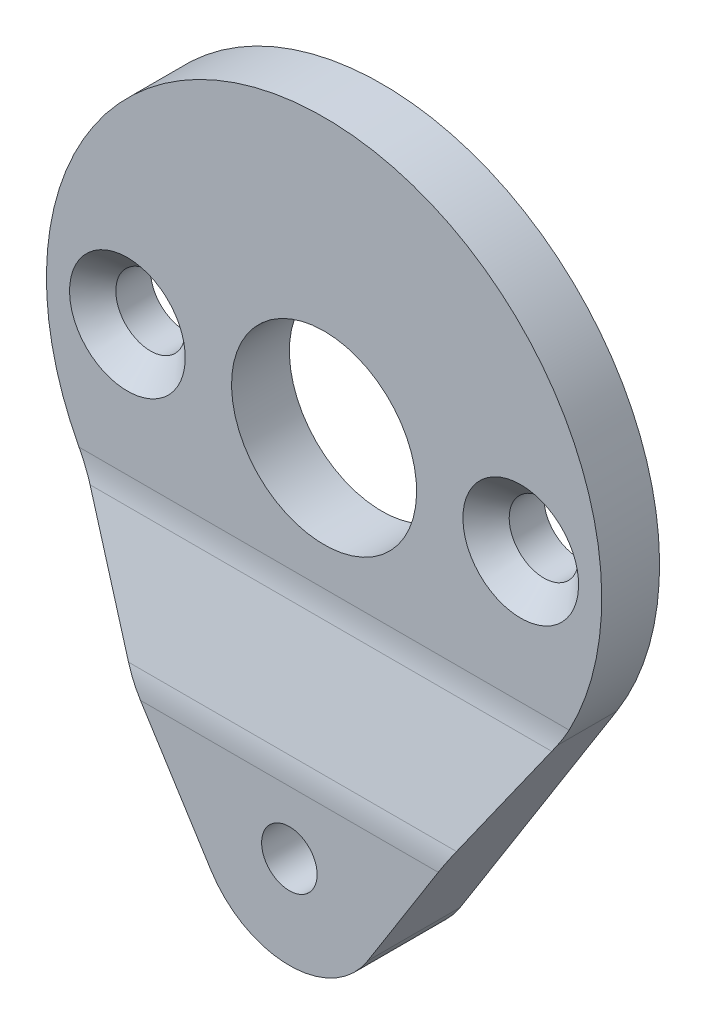
ISO-10303-21;
HEADER;
FILE_DESCRIPTION(('STEP AP214'),'2;1');
FILE_NAME('part.step','',(''),(''),'','','');
FILE_SCHEMA(('AUTOMOTIVE_DESIGN { 1 0 10303 214 1 1 1 1 }'));
ENDSEC;
DATA;
#1=APPLICATION_CONTEXT('core data for automotive mechanical design processes');
#2=APPLICATION_PROTOCOL_DEFINITION('international standard','automotive_design',2000,#1);
#3=PRODUCT_CONTEXT('',#1,'mechanical');
#4=PRODUCT('Part','Part','',(#3));
#5=PRODUCT_RELATED_PRODUCT_CATEGORY('part','',(#4));
#6=PRODUCT_DEFINITION_FORMATION('','',#4);
#7=PRODUCT_DEFINITION_CONTEXT('part definition',#1,'design');
#8=PRODUCT_DEFINITION('design','',#6,#7);
#9=PRODUCT_DEFINITION_SHAPE('','',#8);
#10=(LENGTH_UNIT() NAMED_UNIT(*) SI_UNIT(.MILLI.,.METRE.));
#11=(NAMED_UNIT(*) PLANE_ANGLE_UNIT() SI_UNIT($,.RADIAN.));
#12=(NAMED_UNIT(*) SI_UNIT($,.STERADIAN.) SOLID_ANGLE_UNIT());
#13=UNCERTAINTY_MEASURE_WITH_UNIT(LENGTH_MEASURE(1.E-05),#10,'distance_accuracy_value','');
#14=(GEOMETRIC_REPRESENTATION_CONTEXT(3) GLOBAL_UNCERTAINTY_ASSIGNED_CONTEXT((#13)) GLOBAL_UNIT_ASSIGNED_CONTEXT((#10,
#11,#12)) REPRESENTATION_CONTEXT('',''));
#15=CARTESIAN_POINT('',(0.,0.,0.));
#16=DIRECTION('',(0.,0.,1.));
#17=DIRECTION('',(1.,0.,0.));
#18=AXIS2_PLACEMENT_3D('',#15,#16,#17);
#19=CARTESIAN_POINT('',(0.,0.,4.));
#20=DIRECTION('',(0.,0.,1.));
#21=DIRECTION('',(1.,0.,0.));
#22=AXIS2_PLACEMENT_3D('',#19,#20,#21);
#23=PLANE('',#22);
#24=DIRECTION('',(0.533333333333333,0.845905169363301,0.));
#25=VECTOR('',#24,1.);
#26=CARTESIAN_POINT('',(10.1508620323596,-6.4,4.));
#27=LINE('',#26,#25);
#28=CARTESIAN_POINT('',(3.38362067745321,-17.1333333333333,4.));
#29=VERTEX_POINT('',#28);
#30=CARTESIAN_POINT('',(6.43521990416724,-12.2932766570162,4.));
#31=VERTEX_POINT('',#30);
#32=EDGE_CURVE('E125',#29,#31,#27,.T.);
#33=ORIENTED_EDGE('',*,*,#32,.T.);
#34=DIRECTION('',(1.,0.,0.));
#35=VECTOR('',#34,1.);
#36=CARTESIAN_POINT('',(-6.76724135490642,-12.2932766570162,4.));
#37=LINE('',#36,#35);
#38=CARTESIAN_POINT('',(-6.43521990416724,-12.2932766570162,4.));
#39=VERTEX_POINT('',#38);
#40=EDGE_CURVE('E108',#31,#39,#37,.F.);
#41=ORIENTED_EDGE('',*,*,#40,.T.);
#42=DIRECTION('',(0.533333333333333,-0.845905169363301,0.));
#43=VECTOR('',#42,1.);
#44=CARTESIAN_POINT('',(-10.1508620323596,-6.4,4.));
#45=LINE('',#44,#43);
#46=CARTESIAN_POINT('',(-3.38362067745321,-17.1333333333333,4.));
#47=VERTEX_POINT('',#46);
#48=EDGE_CURVE('E100',#39,#47,#45,.T.);
#49=ORIENTED_EDGE('',*,*,#48,.T.);
#50=CARTESIAN_POINT('',(0.,-15.,4.));
#51=DIRECTION('',(0.,0.,1.));
#52=DIRECTION('',(1.,0.,0.));
#53=AXIS2_PLACEMENT_3D('',#50,#51,#52);
#54=CIRCLE('',#53,4.);
#55=EDGE_CURVE('E105',#47,#29,#54,.T.);
#56=ORIENTED_EDGE('',*,*,#55,.T.);
#57=EDGE_LOOP('',(#33,#41,#49,#56));
#58=FACE_BOUND('',#57,.T.);
#59=CARTESIAN_POINT('',(0.,-15.,4.));
#60=DIRECTION('',(0.,0.,1.));
#61=DIRECTION('',(1.,0.,0.));
#62=AXIS2_PLACEMENT_3D('',#59,#60,#61);
#63=CIRCLE('',#62,1.2);
#64=CARTESIAN_POINT('',(1.2,-15.,4.));
#65=VERTEX_POINT('',#64);
#66=EDGE_CURVE('E328',#65,#65,#63,.T.);
#67=ORIENTED_EDGE('',*,*,#66,.F.);
#68=EDGE_LOOP('',(#67));
#69=FACE_BOUND('',#68,.T.);
#70=ADVANCED_FACE('F33',(#58,#69),#23,.T.);
#71=CARTESIAN_POINT('',(0.,0.,0.));
#72=DIRECTION('',(0.,0.,1.));
#73=DIRECTION('',(1.,0.,0.));
#74=AXIS2_PLACEMENT_3D('',#71,#72,#73);
#75=PLANE('',#74);
#76=CARTESIAN_POINT('',(-8.5,0.,0.));
#77=DIRECTION('',(0.,0.,1.));
#78=DIRECTION('',(1.,0.,0.));
#79=AXIS2_PLACEMENT_3D('',#76,#77,#78);
#80=CIRCLE('',#79,1.5);
#81=CARTESIAN_POINT('',(-7.,0.,0.));
#82=VERTEX_POINT('',#81);
#83=EDGE_CURVE('E318',#82,#82,#80,.T.);
#84=ORIENTED_EDGE('',*,*,#83,.T.);
#85=EDGE_LOOP('',(#84));
#86=FACE_BOUND('',#85,.T.);
#87=CARTESIAN_POINT('',(0.,0.,0.));
#88=DIRECTION('',(0.,0.,1.));
#89=DIRECTION('',(1.,0.,0.));
#90=AXIS2_PLACEMENT_3D('',#87,#88,#89);
#91=CIRCLE('',#90,4.);
#92=CARTESIAN_POINT('',(4.,0.,0.));
#93=VERTEX_POINT('',#92);
#94=EDGE_CURVE('E132',#93,#93,#91,.T.);
#95=ORIENTED_EDGE('',*,*,#94,.T.);
#96=EDGE_LOOP('',(#95));
#97=FACE_BOUND('',#96,.T.);
#98=CARTESIAN_POINT('',(0.,0.,0.));
#99=DIRECTION('',(0.,0.,1.));
#100=DIRECTION('',(1.,0.,0.));
#101=AXIS2_PLACEMENT_3D('',#98,#99,#100);
#102=CIRCLE('',#101,12.);
#103=CARTESIAN_POINT('',(10.1508620323596,-6.4,0.));
#104=VERTEX_POINT('',#103);
#105=CARTESIAN_POINT('',(-10.1508620323596,-6.4,0.));
#106=VERTEX_POINT('',#105);
#107=EDGE_CURVE('E130',#104,#106,#102,.T.);
#108=ORIENTED_EDGE('',*,*,#107,.F.);
#109=DIRECTION('',(0.533333333333333,0.845905169363301,0.));
#110=VECTOR('',#109,1.);
#111=CARTESIAN_POINT('',(10.1508620323596,-6.4,0.));
#112=LINE('',#111,#110);
#113=CARTESIAN_POINT('',(3.38362067745321,-17.1333333333333,0.));
#114=VERTEX_POINT('',#113);
#115=EDGE_CURVE('E111',#114,#104,#112,.T.);
#116=ORIENTED_EDGE('',*,*,#115,.F.);
#117=CARTESIAN_POINT('',(0.,-15.,0.));
#118=DIRECTION('',(0.,0.,1.));
#119=DIRECTION('',(1.,0.,0.));
#120=AXIS2_PLACEMENT_3D('',#117,#118,#119);
#121=CIRCLE('',#120,4.);
#122=CARTESIAN_POINT('',(-3.38362067745321,-17.1333333333333,0.));
#123=VERTEX_POINT('',#122);
#124=EDGE_CURVE('E134',#123,#114,#121,.T.);
#125=ORIENTED_EDGE('',*,*,#124,.F.);
#126=DIRECTION('',(0.533333333333333,-0.845905169363301,0.));
#127=VECTOR('',#126,1.);
#128=CARTESIAN_POINT('',(-10.1508620323596,-6.4,0.));
#129=LINE('',#128,#127);
#130=EDGE_CURVE('E117',#106,#123,#129,.T.);
#131=ORIENTED_EDGE('',*,*,#130,.F.);
#132=EDGE_LOOP('',(#108,#116,#125,#131));
#133=FACE_BOUND('',#132,.T.);
#134=CARTESIAN_POINT('',(0.,-15.,0.));
#135=DIRECTION('',(0.,0.,1.));
#136=DIRECTION('',(1.,0.,0.));
#137=AXIS2_PLACEMENT_3D('',#134,#135,#136);
#138=CIRCLE('',#137,1.2);
#139=CARTESIAN_POINT('',(1.2,-15.,0.));
#140=VERTEX_POINT('',#139);
#141=EDGE_CURVE('E327',#140,#140,#138,.T.);
#142=ORIENTED_EDGE('',*,*,#141,.T.);
#143=EDGE_LOOP('',(#142));
#144=FACE_BOUND('',#143,.T.);
#145=CARTESIAN_POINT('',(8.5,0.,0.));
#146=DIRECTION('',(0.,0.,1.));
#147=DIRECTION('',(1.,0.,0.));
#148=AXIS2_PLACEMENT_3D('',#145,#146,#147);
#149=CIRCLE('',#148,1.5);
#150=CARTESIAN_POINT('',(10.,0.,0.));
#151=VERTEX_POINT('',#150);
#152=EDGE_CURVE('E314',#151,#151,#149,.T.);
#153=ORIENTED_EDGE('',*,*,#152,.T.);
#154=EDGE_LOOP('',(#153));
#155=FACE_BOUND('',#154,.T.);
#156=ADVANCED_FACE('F200',(#86,#97,#133,#144,#155),#75,.F.);
#157=CARTESIAN_POINT('',(0.,0.,4.));
#158=DIRECTION('',(0.,0.,-1.));
#159=DIRECTION('',(-1.,0.,0.));
#160=AXIS2_PLACEMENT_3D('',#157,#158,#159);
#161=CYLINDRICAL_SURFACE('',#160,12.);
#162=DIRECTION('',(0.,0.,-1.));
#163=VECTOR('',#162,1.);
#164=CARTESIAN_POINT('',(-10.1508620323596,-6.4,4.));
#165=LINE('',#164,#163);
#166=CARTESIAN_POINT('',(-10.1508620323596,-6.4,2.57248088680612));
#167=VERTEX_POINT('',#166);
#168=EDGE_CURVE('E51',#167,#106,#165,.T.);
#169=ORIENTED_EDGE('',*,*,#168,.F.);
#170=CARTESIAN_POINT('',(-10.1508620323596,-6.4,2.57248088680612));
#171=CARTESIAN_POINT('',(-10.1895281159444,-6.33867523091305,2.56064498576014));
#172=CARTESIAN_POINT('',(-10.2277587234396,-6.2768044388253,2.55019375928328));
#173=CARTESIAN_POINT('',(-10.3031930060154,-6.15219476198761,2.53217481626388));
#174=CARTESIAN_POINT('',(-10.3403985495034,-6.08945781953167,2.52460148013174));
#175=CARTESIAN_POINT('',(-10.4137800673645,-5.96309667895968,2.51240511748876));
#176=CARTESIAN_POINT('',(-10.4499560160382,-5.8994724587556,2.5077821645597));
#177=CARTESIAN_POINT('',(-10.521268900915,-5.77133409184007,2.5015764039898));
#178=CARTESIAN_POINT('',(-10.556403653718,-5.70681844097637,2.49999959341046));
#179=CARTESIAN_POINT('',(-10.590942188161,-5.64198046496363,2.5));
#180=B_SPLINE_CURVE_WITH_KNOTS('',3,(#170,#171,#172,#173,#174,#175,#176,#177,#178,#179),
.UNSPECIFIED.,.F.,.F.,(4,2,2,2,4),(0.,0.220358722338277,0.440284916784244,0.660216595917763,
0.880580823789163),.UNSPECIFIED.);
#181=CARTESIAN_POINT('',(-10.590942188161,-5.64198046496363,2.5));
#182=VERTEX_POINT('',#181);
#183=EDGE_CURVE('E11',#167,#182,#180,.T.);
#184=ORIENTED_EDGE('',*,*,#183,.T.);
#185=CARTESIAN_POINT('',(0.,0.,2.5));
#186=DIRECTION('',(0.,0.,-1.));
#187=DIRECTION('',(0.,1.,0.));
#188=AXIS2_PLACEMENT_3D('',#185,#186,#187);
#189=CIRCLE('',#188,12.);
#190=CARTESIAN_POINT('',(10.590942188161,-5.64198046496363,2.5));
#191=VERTEX_POINT('',#190);
#192=EDGE_CURVE('E315',#182,#191,#189,.T.);
#193=ORIENTED_EDGE('',*,*,#192,.T.);
#194=CARTESIAN_POINT('',(10.590942188161,-5.64198046496363,2.5));
#195=CARTESIAN_POINT('',(10.556403653718,-5.70681844097637,2.49999959341046));
#196=CARTESIAN_POINT('',(10.521268900915,-5.77133409184007,2.5015764039898));
#197=CARTESIAN_POINT('',(10.4499560160382,-5.8994724587556,2.5077821645597));
#198=CARTESIAN_POINT('',(10.4137800673645,-5.96309667895968,2.51240511748876));
#199=CARTESIAN_POINT('',(10.3403985495034,-6.08945781953167,2.52460148013174));
#200=CARTESIAN_POINT('',(10.3031930060154,-6.15219476198761,2.53217481626388));
#201=CARTESIAN_POINT('',(10.2277587234396,-6.2768044388253,2.55019375928328));
#202=CARTESIAN_POINT('',(10.1895281159444,-6.33867523091305,2.56064498576014));
#203=CARTESIAN_POINT('',(10.1508620323596,-6.4,2.57248088680612));
#204=B_SPLINE_CURVE_WITH_KNOTS('',3,(#194,#195,#196,#197,#198,#199,#200,#201,#202,#203),
.UNSPECIFIED.,.F.,.F.,(4,2,2,2,4),(0.,0.220364227871402,0.440295907004918,0.660222101450886,
0.880580823789162),.UNSPECIFIED.);
#205=CARTESIAN_POINT('',(10.1508620323596,-6.4,2.57248088680612));
#206=VERTEX_POINT('',#205);
#207=EDGE_CURVE('E168',#191,#206,#204,.T.);
#208=ORIENTED_EDGE('',*,*,#207,.T.);
#209=DIRECTION('',(0.,0.,-1.));
#210=VECTOR('',#209,1.);
#211=CARTESIAN_POINT('',(10.1508620323596,-6.4,4.));
#212=LINE('',#211,#210);
#213=EDGE_CURVE('E59',#206,#104,#212,.T.);
#214=ORIENTED_EDGE('',*,*,#213,.T.);
#215=ORIENTED_EDGE('',*,*,#107,.T.);
#216=EDGE_LOOP('',(#169,#184,#193,#208,#214,#215));
#217=FACE_BOUND('',#216,.T.);
#218=ADVANCED_FACE('F174',(#217),#161,.T.);
#219=CARTESIAN_POINT('',(-10.1508620323596,-6.4,4.));
#220=DIRECTION('',(0.845905169363302,0.533333333333333,0.));
#221=DIRECTION('',(-0.533333333333333,0.845905169363302,0.));
#222=AXIS2_PLACEMENT_3D('',#219,#220,#221);
#223=PLANE('',#222);
#224=ORIENTED_EDGE('',*,*,#48,.F.);
#225=CARTESIAN_POINT('',(-6.43521990416724,-12.2932766570162,0.));
#226=DIRECTION('',(0.845905169363302,0.533333333333333,0.));
#227=DIRECTION('',(-0.533333333333333,0.845905169363302,0.));
#228=AXIS2_PLACEMENT_3D('',#225,#226,#227);
#229=ELLIPSE('',#228,4.7286624374346,4.);
#230=CARTESIAN_POINT('',(-7.08794944905735,-11.2580004766062,3.86370330515628));
#231=VERTEX_POINT('',#230);
#232=EDGE_CURVE('E166',#39,#231,#229,.F.);
#233=ORIENTED_EDGE('',*,*,#232,.T.);
#234=DIRECTION('',(-0.52013968726768,0.824979094220141,-0.22105248206884));
#235=VECTOR('',#234,1.);
#236=CARTESIAN_POINT('',(-9.9855241154317,-6.66223787241453,2.63227242675801));
#237=LINE('',#236,#235);
#238=CARTESIAN_POINT('',(-9.97605495442526,-6.67725664537369,2.63629669484372));
#239=VERTEX_POINT('',#238);
#240=EDGE_CURVE('E309',#231,#239,#237,.T.);
#241=ORIENTED_EDGE('',*,*,#240,.T.);
#242=CARTESIAN_POINT('',(-10.6287844993154,-5.64198046496363,6.5));
#243=DIRECTION('',(0.845905169363302,0.533333333333333,0.));
#244=DIRECTION('',(-0.533333333333333,0.845905169363302,0.));
#245=AXIS2_PLACEMENT_3D('',#242,#243,#244);
#246=ELLIPSE('',#245,4.7286624374346,4.);
#247=EDGE_CURVE('E45',#239,#167,#246,.T.);
#248=ORIENTED_EDGE('',*,*,#247,.T.);
#249=ORIENTED_EDGE('',*,*,#168,.T.);
#250=ORIENTED_EDGE('',*,*,#130,.T.);
#251=DIRECTION('',(0.,0.,-1.));
#252=VECTOR('',#251,1.);
#253=CARTESIAN_POINT('',(-3.38362067745321,-17.1333333333333,4.));
#254=LINE('',#253,#252);
#255=EDGE_CURVE('E114',#47,#123,#254,.T.);
#256=ORIENTED_EDGE('',*,*,#255,.F.);
#257=EDGE_LOOP('',(#224,#233,#241,#248,#249,#250,#256));
#258=FACE_BOUND('',#257,.T.);
#259=ADVANCED_FACE('F115',(#258),#223,.F.);
#260=CARTESIAN_POINT('',(0.,-15.,4.));
#261=DIRECTION('',(0.,0.,-1.));
#262=DIRECTION('',(-1.,0.,0.));
#263=AXIS2_PLACEMENT_3D('',#260,#261,#262);
#264=CYLINDRICAL_SURFACE('',#263,4.);
#265=ORIENTED_EDGE('',*,*,#124,.T.);
#266=DIRECTION('',(0.,0.,-1.));
#267=VECTOR('',#266,1.);
#268=CARTESIAN_POINT('',(3.38362067745321,-17.1333333333333,4.));
#269=LINE('',#268,#267);
#270=EDGE_CURVE('E120',#29,#114,#269,.T.);
#271=ORIENTED_EDGE('',*,*,#270,.F.);
#272=ORIENTED_EDGE('',*,*,#55,.F.);
#273=ORIENTED_EDGE('',*,*,#255,.T.);
#274=EDGE_LOOP('',(#265,#271,#272,#273));
#275=FACE_BOUND('',#274,.T.);
#276=ADVANCED_FACE('F122',(#275),#264,.T.);
#277=CARTESIAN_POINT('',(10.1508620323596,-6.4,4.));
#278=DIRECTION('',(-0.845905169363302,0.533333333333333,0.));
#279=DIRECTION('',(-0.533333333333333,-0.845905169363302,0.));
#280=AXIS2_PLACEMENT_3D('',#277,#278,#279);
#281=PLANE('',#280);
#282=DIRECTION('',(-0.52013968726768,-0.824979094220141,0.22105248206884));
#283=VECTOR('',#282,1.);
#284=CARTESIAN_POINT('',(9.9855241154317,-6.66223787241453,2.63227242675801));
#285=LINE('',#284,#283);
#286=CARTESIAN_POINT('',(9.97605495442526,-6.67725664537369,2.63629669484372));
#287=VERTEX_POINT('',#286);
#288=CARTESIAN_POINT('',(7.08794944905735,-11.2580004766062,3.86370330515628));
#289=VERTEX_POINT('',#288);
#290=EDGE_CURVE('E140',#287,#289,#285,.T.);
#291=ORIENTED_EDGE('',*,*,#290,.T.);
#292=CARTESIAN_POINT('',(6.43521990416724,-12.2932766570162,0.));
#293=DIRECTION('',(-0.845905169363302,0.533333333333333,0.));
#294=DIRECTION('',(-0.533333333333333,-0.845905169363302,0.));
#295=AXIS2_PLACEMENT_3D('',#292,#293,#294);
#296=ELLIPSE('',#295,4.7286624374346,4.);
#297=EDGE_CURVE('E163',#289,#31,#296,.F.);
#298=ORIENTED_EDGE('',*,*,#297,.T.);
#299=ORIENTED_EDGE('',*,*,#32,.F.);
#300=ORIENTED_EDGE('',*,*,#270,.T.);
#301=ORIENTED_EDGE('',*,*,#115,.T.);
#302=ORIENTED_EDGE('',*,*,#213,.F.);
#303=CARTESIAN_POINT('',(10.6287844993154,-5.64198046496363,6.5));
#304=DIRECTION('',(-0.845905169363302,0.533333333333333,0.));
#305=DIRECTION('',(-0.533333333333333,-0.845905169363302,0.));
#306=AXIS2_PLACEMENT_3D('',#303,#304,#305);
#307=ELLIPSE('',#306,4.7286624374346,4.);
#308=EDGE_CURVE('E173',#206,#287,#307,.T.);
#309=ORIENTED_EDGE('',*,*,#308,.T.);
#310=EDGE_LOOP('',(#291,#298,#299,#300,#301,#302,#309));
#311=FACE_BOUND('',#310,.T.);
#312=ADVANCED_FACE('F211',(#311),#281,.F.);
#313=CARTESIAN_POINT('',(0.,0.,4.));
#314=DIRECTION('',(0.,0.,-1.));
#315=DIRECTION('',(-1.,0.,0.));
#316=AXIS2_PLACEMENT_3D('',#313,#314,#315);
#317=CYLINDRICAL_SURFACE('',#316,4.);
#318=CARTESIAN_POINT('',(0.,0.,2.5));
#319=DIRECTION('',(0.,0.,-1.));
#320=DIRECTION('',(0.,1.,0.));
#321=AXIS2_PLACEMENT_3D('',#318,#319,#320);
#322=CIRCLE('',#321,4.);
#323=CARTESIAN_POINT('',(0.,4.,2.5));
#324=VERTEX_POINT('',#323);
#325=EDGE_CURVE('E321',#324,#324,#322,.T.);
#326=ORIENTED_EDGE('',*,*,#325,.F.);
#327=EDGE_LOOP('',(#326));
#328=FACE_BOUND('',#327,.T.);
#329=ORIENTED_EDGE('',*,*,#94,.F.);
#330=EDGE_LOOP('',(#329));
#331=FACE_BOUND('',#330,.T.);
#332=ADVANCED_FACE('F208',(#328,#331),#317,.F.);
#333=CARTESIAN_POINT('',(0.,-15.,4.));
#334=DIRECTION('',(0.,0.,-1.));
#335=DIRECTION('',(-1.,0.,0.));
#336=AXIS2_PLACEMENT_3D('',#333,#334,#335);
#337=CYLINDRICAL_SURFACE('',#336,1.2);
#338=ORIENTED_EDGE('',*,*,#66,.T.);
#339=EDGE_LOOP('',(#338));
#340=FACE_BOUND('',#339,.T.);
#341=ORIENTED_EDGE('',*,*,#141,.F.);
#342=EDGE_LOOP('',(#341));
#343=FACE_BOUND('',#342,.T.);
#344=ADVANCED_FACE('F239',(#340,#343),#337,.F.);
#345=CARTESIAN_POINT('',(-8.5,0.,4.));
#346=DIRECTION('',(0.,0.,-1.));
#347=DIRECTION('',(-1.,0.,0.));
#348=AXIS2_PLACEMENT_3D('',#345,#346,#347);
#349=CYLINDRICAL_SURFACE('',#348,1.5);
#350=CARTESIAN_POINT('',(-8.5,0.,1.5));
#351=DIRECTION('',(0.,0.,-1.));
#352=DIRECTION('',(-1.,0.,0.));
#353=AXIS2_PLACEMENT_3D('',#350,#351,#352);
#354=CIRCLE('',#353,1.5);
#355=CARTESIAN_POINT('',(-10.,0.,1.5));
#356=VERTEX_POINT('',#355);
#357=EDGE_CURVE('E152',#356,#356,#354,.F.);
#358=ORIENTED_EDGE('',*,*,#357,.T.);
#359=EDGE_LOOP('',(#358));
#360=FACE_BOUND('',#359,.T.);
#361=ORIENTED_EDGE('',*,*,#83,.F.);
#362=EDGE_LOOP('',(#361));
#363=FACE_BOUND('',#362,.T.);
#364=ADVANCED_FACE('F244',(#360,#363),#349,.F.);
#365=CARTESIAN_POINT('',(8.5,0.,4.));
#366=DIRECTION('',(0.,0.,-1.));
#367=DIRECTION('',(-1.,0.,0.));
#368=AXIS2_PLACEMENT_3D('',#365,#366,#367);
#369=CYLINDRICAL_SURFACE('',#368,1.5);
#370=CARTESIAN_POINT('',(8.5,0.,1.5));
#371=DIRECTION('',(0.,0.,-1.));
#372=DIRECTION('',(-1.,0.,0.));
#373=AXIS2_PLACEMENT_3D('',#370,#371,#372);
#374=CIRCLE('',#373,1.5);
#375=CARTESIAN_POINT('',(7.,0.,1.5));
#376=VERTEX_POINT('',#375);
#377=EDGE_CURVE('E149',#376,#376,#374,.F.);
#378=ORIENTED_EDGE('',*,*,#377,.T.);
#379=EDGE_LOOP('',(#378));
#380=FACE_BOUND('',#379,.T.);
#381=ORIENTED_EDGE('',*,*,#152,.F.);
#382=EDGE_LOOP('',(#381));
#383=FACE_BOUND('',#382,.T.);
#384=ADVANCED_FACE('F261',(#380,#383),#369,.F.);
#385=CARTESIAN_POINT('',(-25.,-11.7666666666667,4.));
#386=DIRECTION('',(0.,-0.258819045102514,-0.96592582628907));
#387=DIRECTION('',(0.,0.96592582628907,-0.258819045102514));
#388=AXIS2_PLACEMENT_3D('',#385,#386,#387);
#389=PLANE('',#388);
#390=ORIENTED_EDGE('',*,*,#290,.F.);
#391=DIRECTION('',(1.,0.,0.));
#392=VECTOR('',#391,1.);
#393=CARTESIAN_POINT('',(-10.2931283774477,-6.67725664537369,2.63629669484372));
#394=LINE('',#393,#392);
#395=EDGE_CURVE('E161',#287,#239,#394,.F.);
#396=ORIENTED_EDGE('',*,*,#395,.T.);
#397=ORIENTED_EDGE('',*,*,#240,.F.);
#398=DIRECTION('',(1.,0.,0.));
#399=VECTOR('',#398,1.);
#400=CARTESIAN_POINT('',(6.76724135490642,-11.2580004766062,3.86370330515628));
#401=LINE('',#400,#399);
#402=EDGE_CURVE('E158',#231,#289,#401,.T.);
#403=ORIENTED_EDGE('',*,*,#402,.T.);
#404=EDGE_LOOP('',(#390,#396,#397,#403));
#405=FACE_BOUND('',#404,.T.);
#406=ADVANCED_FACE('F194',(#405),#389,.F.);
#407=CARTESIAN_POINT('',(-25.,-6.1685904553132,2.5));
#408=DIRECTION('',(0.,0.,-1.));
#409=DIRECTION('',(0.,1.,0.));
#410=AXIS2_PLACEMENT_3D('',#407,#408,#409);
#411=PLANE('',#410);
#412=CARTESIAN_POINT('',(8.5,0.,2.5));
#413=DIRECTION('',(0.,0.,-1.));
#414=DIRECTION('',(0.,1.,0.));
#415=AXIS2_PLACEMENT_3D('',#412,#413,#414);
#416=CIRCLE('',#415,2.5);
#417=CARTESIAN_POINT('',(8.5,2.5,2.5));
#418=VERTEX_POINT('',#417);
#419=EDGE_CURVE('E146',#418,#418,#416,.T.);
#420=ORIENTED_EDGE('',*,*,#419,.T.);
#421=EDGE_LOOP('',(#420));
#422=FACE_BOUND('',#421,.T.);
#423=CARTESIAN_POINT('',(-8.5,0.,2.5));
#424=DIRECTION('',(0.,0.,-1.));
#425=DIRECTION('',(0.,1.,0.));
#426=AXIS2_PLACEMENT_3D('',#423,#424,#425);
#427=CIRCLE('',#426,2.5);
#428=CARTESIAN_POINT('',(-8.5,2.5,2.5));
#429=VERTEX_POINT('',#428);
#430=EDGE_CURVE('E143',#429,#429,#427,.T.);
#431=ORIENTED_EDGE('',*,*,#430,.T.);
#432=EDGE_LOOP('',(#431));
#433=FACE_BOUND('',#432,.T.);
#434=ORIENTED_EDGE('',*,*,#325,.T.);
#435=EDGE_LOOP('',(#434));
#436=FACE_BOUND('',#435,.T.);
#437=ORIENTED_EDGE('',*,*,#192,.F.);
#438=DIRECTION('',(1.,0.,0.));
#439=VECTOR('',#438,1.);
#440=CARTESIAN_POINT('',(10.2931283774477,-5.64198046496363,2.5));
#441=LINE('',#440,#439);
#442=EDGE_CURVE('E155',#182,#191,#441,.T.);
#443=ORIENTED_EDGE('',*,*,#442,.T.);
#444=EDGE_LOOP('',(#437,#443));
#445=FACE_BOUND('',#444,.T.);
#446=ADVANCED_FACE('F189',(#422,#433,#436,#445),#411,.F.);
#447=CARTESIAN_POINT('',(8.5,0.,2.5));
#448=DIRECTION('',(0.,0.,1.));
#449=DIRECTION('',(1.,0.,0.));
#450=AXIS2_PLACEMENT_3D('',#447,#448,#449);
#451=CONICAL_SURFACE('',#450,2.5,0.785398163397447);
#452=ORIENTED_EDGE('',*,*,#377,.F.);
#453=EDGE_LOOP('',(#452));
#454=FACE_BOUND('',#453,.T.);
#455=ORIENTED_EDGE('',*,*,#419,.F.);
#456=EDGE_LOOP('',(#455));
#457=FACE_BOUND('',#456,.T.);
#458=ADVANCED_FACE('F186',(#454,#457),#451,.F.);
#459=CARTESIAN_POINT('',(-8.5,0.,2.5));
#460=DIRECTION('',(0.,0.,1.));
#461=DIRECTION('',(1.,0.,0.));
#462=AXIS2_PLACEMENT_3D('',#459,#460,#461);
#463=CONICAL_SURFACE('',#462,2.5,0.785398163397447);
#464=ORIENTED_EDGE('',*,*,#357,.F.);
#465=EDGE_LOOP('',(#464));
#466=FACE_BOUND('',#465,.T.);
#467=ORIENTED_EDGE('',*,*,#430,.F.);
#468=EDGE_LOOP('',(#467));
#469=FACE_BOUND('',#468,.T.);
#470=ADVANCED_FACE('F182',(#466,#469),#463,.F.);
#471=CARTESIAN_POINT('',(-25.,-5.64198046496363,6.5));
#472=DIRECTION('',(-1.,0.,0.));
#473=DIRECTION('',(0.,0.,1.));
#474=AXIS2_PLACEMENT_3D('',#471,#472,#473);
#475=CYLINDRICAL_SURFACE('',#474,4.);
#476=ORIENTED_EDGE('',*,*,#247,.F.);
#477=ORIENTED_EDGE('',*,*,#395,.F.);
#478=ORIENTED_EDGE('',*,*,#308,.F.);
#479=ORIENTED_EDGE('',*,*,#207,.F.);
#480=ORIENTED_EDGE('',*,*,#442,.F.);
#481=ORIENTED_EDGE('',*,*,#183,.F.);
#482=EDGE_LOOP('',(#476,#477,#478,#479,#480,#481));
#483=FACE_BOUND('',#482,.T.);
#484=ADVANCED_FACE('F178',(#483),#475,.F.);
#485=CARTESIAN_POINT('',(-25.,-12.2932766570162,0.));
#486=DIRECTION('',(-1.,0.,0.));
#487=DIRECTION('',(0.,0.,1.));
#488=AXIS2_PLACEMENT_3D('',#485,#486,#487);
#489=CYLINDRICAL_SURFACE('',#488,4.);
#490=ORIENTED_EDGE('',*,*,#232,.F.);
#491=ORIENTED_EDGE('',*,*,#40,.F.);
#492=ORIENTED_EDGE('',*,*,#297,.F.);
#493=ORIENTED_EDGE('',*,*,#402,.F.);
#494=EDGE_LOOP('',(#490,#491,#492,#493));
#495=FACE_BOUND('',#494,.T.);
#496=ADVANCED_FACE('F35',(#495),#489,.T.);
#497=CLOSED_SHELL('',(#70,#156,#218,#259,#276,#312,#332,#344,#364,#384,#406,#446,#458,#470,#484,#496));
#498=MANIFOLD_SOLID_BREP('B2',#497);
#499=ADVANCED_BREP_SHAPE_REPRESENTATION('',(#18,#498),#14);
#500=SHAPE_DEFINITION_REPRESENTATION(#9,#499);
ENDSEC;
END-ISO-10303-21;
